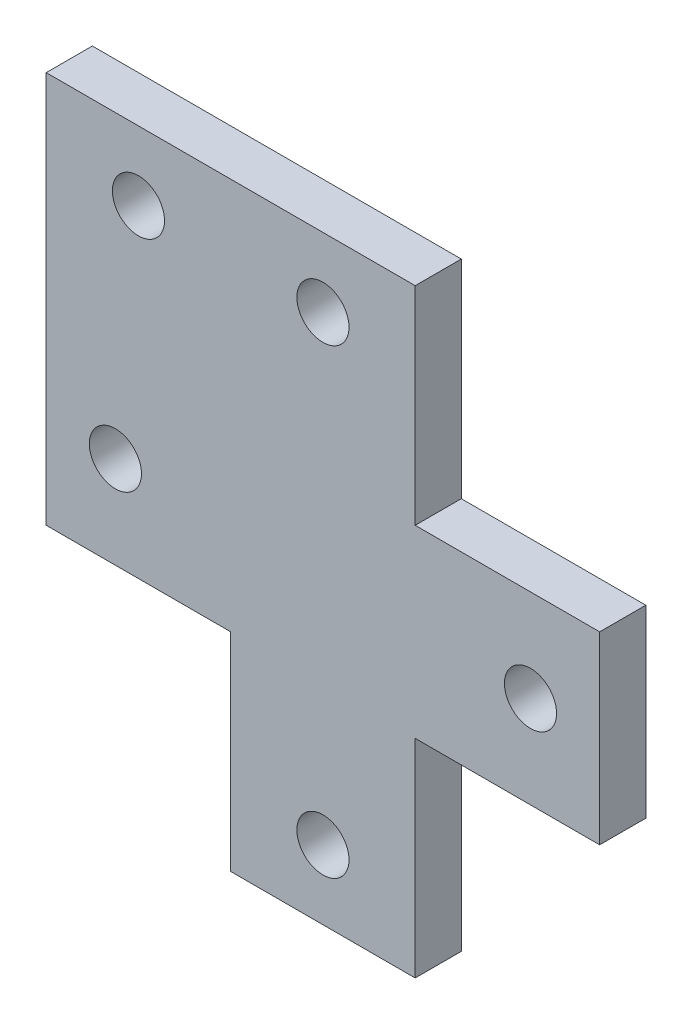
ISO-10303-21;
HEADER;
FILE_DESCRIPTION(('STEP AP214'),'2;1');
FILE_NAME('part.step','',(''),(''),'','','');
FILE_SCHEMA(('AUTOMOTIVE_DESIGN { 1 0 10303 214 1 1 1 1 }'));
ENDSEC;
DATA;
#1=APPLICATION_CONTEXT('core data for automotive mechanical design processes');
#2=APPLICATION_PROTOCOL_DEFINITION('international standard','automotive_design',2000,#1);
#3=PRODUCT_CONTEXT('',#1,'mechanical');
#4=PRODUCT('Part','Part','',(#3));
#5=PRODUCT_RELATED_PRODUCT_CATEGORY('part','',(#4));
#6=PRODUCT_DEFINITION_FORMATION('','',#4);
#7=PRODUCT_DEFINITION_CONTEXT('part definition',#1,'design');
#8=PRODUCT_DEFINITION('design','',#6,#7);
#9=PRODUCT_DEFINITION_SHAPE('','',#8);
#10=(LENGTH_UNIT() NAMED_UNIT(*) SI_UNIT(.MILLI.,.METRE.));
#11=(NAMED_UNIT(*) PLANE_ANGLE_UNIT() SI_UNIT($,.RADIAN.));
#12=(NAMED_UNIT(*) SI_UNIT($,.STERADIAN.) SOLID_ANGLE_UNIT());
#13=UNCERTAINTY_MEASURE_WITH_UNIT(LENGTH_MEASURE(1.E-05),#10,'distance_accuracy_value','');
#14=(GEOMETRIC_REPRESENTATION_CONTEXT(3) GLOBAL_UNCERTAINTY_ASSIGNED_CONTEXT((#13)) GLOBAL_UNIT_ASSIGNED_CONTEXT((#10,
#11,#12)) REPRESENTATION_CONTEXT('',''));
#15=CARTESIAN_POINT('',(0.,0.,0.));
#16=DIRECTION('',(0.,0.,1.));
#17=DIRECTION('',(1.,0.,0.));
#18=AXIS2_PLACEMENT_3D('',#15,#16,#17);
#19=CARTESIAN_POINT('',(0.,0.,2.));
#20=DIRECTION('',(0.,1.,0.));
#21=DIRECTION('',(0.,0.,1.));
#22=AXIS2_PLACEMENT_3D('',#19,#20,#21);
#23=PLANE('',#22);
#24=DIRECTION('',(1.,0.,0.));
#25=VECTOR('',#24,1.);
#26=CARTESIAN_POINT('',(0.,0.,0.));
#27=LINE('',#26,#25);
#28=CARTESIAN_POINT('',(-8.,0.,0.));
#29=VERTEX_POINT('',#28);
#30=CARTESIAN_POINT('',(8.,0.,0.));
#31=VERTEX_POINT('',#30);
#32=EDGE_CURVE('E162',#29,#31,#27,.T.);
#33=ORIENTED_EDGE('',*,*,#32,.F.);
#34=DIRECTION('',(0.,0.,-1.));
#35=VECTOR('',#34,1.);
#36=CARTESIAN_POINT('',(-8.,0.,2.));
#37=LINE('',#36,#35);
#38=CARTESIAN_POINT('',(-8.,0.,2.));
#39=VERTEX_POINT('',#38);
#40=EDGE_CURVE('E11',#39,#29,#37,.T.);
#41=ORIENTED_EDGE('',*,*,#40,.F.);
#42=DIRECTION('',(1.,0.,0.));
#43=VECTOR('',#42,1.);
#44=CARTESIAN_POINT('',(0.,0.,2.));
#45=LINE('',#44,#43);
#46=CARTESIAN_POINT('',(8.,0.,2.));
#47=VERTEX_POINT('',#46);
#48=EDGE_CURVE('E199',#39,#47,#45,.T.);
#49=ORIENTED_EDGE('',*,*,#48,.T.);
#50=DIRECTION('',(0.,0.,-1.));
#51=VECTOR('',#50,1.);
#52=CARTESIAN_POINT('',(8.,0.,2.));
#53=LINE('',#52,#51);
#54=EDGE_CURVE('E68',#47,#31,#53,.T.);
#55=ORIENTED_EDGE('',*,*,#54,.T.);
#56=EDGE_LOOP('',(#33,#41,#49,#55));
#57=FACE_BOUND('',#56,.T.);
#58=ADVANCED_FACE('F51',(#57),#23,.T.);
#59=CARTESIAN_POINT('',(-8.,0.,2.));
#60=DIRECTION('',(1.,0.,0.));
#61=DIRECTION('',(0.,0.,-1.));
#62=AXIS2_PLACEMENT_3D('',#59,#60,#61);
#63=PLANE('',#62);
#64=DIRECTION('',(0.,-1.,0.));
#65=VECTOR('',#64,1.);
#66=CARTESIAN_POINT('',(-8.,0.,0.));
#67=LINE('',#66,#65);
#68=CARTESIAN_POINT('',(-8.,-17.,0.));
#69=VERTEX_POINT('',#68);
#70=EDGE_CURVE('E165',#29,#69,#67,.T.);
#71=ORIENTED_EDGE('',*,*,#70,.T.);
#72=DIRECTION('',(0.,0.,-1.));
#73=VECTOR('',#72,1.);
#74=CARTESIAN_POINT('',(-8.,-17.,2.));
#75=LINE('',#74,#73);
#76=CARTESIAN_POINT('',(-8.,-17.,2.));
#77=VERTEX_POINT('',#76);
#78=EDGE_CURVE('E60',#77,#69,#75,.T.);
#79=ORIENTED_EDGE('',*,*,#78,.F.);
#80=DIRECTION('',(0.,-1.,0.));
#81=VECTOR('',#80,1.);
#82=CARTESIAN_POINT('',(-8.,0.,2.));
#83=LINE('',#82,#81);
#84=EDGE_CURVE('E337',#39,#77,#83,.T.);
#85=ORIENTED_EDGE('',*,*,#84,.F.);
#86=ORIENTED_EDGE('',*,*,#40,.T.);
#87=EDGE_LOOP('',(#71,#79,#85,#86));
#88=FACE_BOUND('',#87,.T.);
#89=ADVANCED_FACE('F230',(#88),#63,.F.);
#90=CARTESIAN_POINT('',(0.,-17.,2.));
#91=DIRECTION('',(0.,1.,0.));
#92=DIRECTION('',(0.,0.,1.));
#93=AXIS2_PLACEMENT_3D('',#90,#91,#92);
#94=PLANE('',#93);
#95=DIRECTION('',(1.,0.,0.));
#96=VECTOR('',#95,1.);
#97=CARTESIAN_POINT('',(0.,-17.,0.));
#98=LINE('',#97,#96);
#99=CARTESIAN_POINT('',(0.,-17.,0.));
#100=VERTEX_POINT('',#99);
#101=EDGE_CURVE('E170',#69,#100,#98,.T.);
#102=ORIENTED_EDGE('',*,*,#101,.T.);
#103=DIRECTION('',(0.,0.,-1.));
#104=VECTOR('',#103,1.);
#105=CARTESIAN_POINT('',(0.,-17.,2.));
#106=LINE('',#105,#104);
#107=CARTESIAN_POINT('',(0.,-17.,2.));
#108=VERTEX_POINT('',#107);
#109=EDGE_CURVE('E216',#108,#100,#106,.T.);
#110=ORIENTED_EDGE('',*,*,#109,.F.);
#111=DIRECTION('',(1.,0.,0.));
#112=VECTOR('',#111,1.);
#113=CARTESIAN_POINT('',(0.,-17.,2.));
#114=LINE('',#113,#112);
#115=EDGE_CURVE('E226',#77,#108,#114,.T.);
#116=ORIENTED_EDGE('',*,*,#115,.F.);
#117=ORIENTED_EDGE('',*,*,#78,.T.);
#118=EDGE_LOOP('',(#102,#110,#116,#117));
#119=FACE_BOUND('',#118,.T.);
#120=ADVANCED_FACE('F223',(#119),#94,.F.);
#121=CARTESIAN_POINT('',(0.,0.,2.));
#122=DIRECTION('',(1.,0.,0.));
#123=DIRECTION('',(0.,0.,-1.));
#124=AXIS2_PLACEMENT_3D('',#121,#122,#123);
#125=PLANE('',#124);
#126=DIRECTION('',(0.,-1.,0.));
#127=VECTOR('',#126,1.);
#128=CARTESIAN_POINT('',(0.,0.,0.));
#129=LINE('',#128,#127);
#130=CARTESIAN_POINT('',(0.,-26.,0.));
#131=VERTEX_POINT('',#130);
#132=EDGE_CURVE('E174',#100,#131,#129,.T.);
#133=ORIENTED_EDGE('',*,*,#132,.T.);
#134=DIRECTION('',(0.,0.,-1.));
#135=VECTOR('',#134,1.);
#136=CARTESIAN_POINT('',(0.,-26.,2.));
#137=LINE('',#136,#135);
#138=CARTESIAN_POINT('',(0.,-26.,2.));
#139=VERTEX_POINT('',#138);
#140=EDGE_CURVE('E212',#139,#131,#137,.T.);
#141=ORIENTED_EDGE('',*,*,#140,.F.);
#142=DIRECTION('',(0.,-1.,0.));
#143=VECTOR('',#142,1.);
#144=CARTESIAN_POINT('',(0.,0.,2.));
#145=LINE('',#144,#143);
#146=EDGE_CURVE('E342',#108,#139,#145,.T.);
#147=ORIENTED_EDGE('',*,*,#146,.F.);
#148=ORIENTED_EDGE('',*,*,#109,.T.);
#149=EDGE_LOOP('',(#133,#141,#147,#148));
#150=FACE_BOUND('',#149,.T.);
#151=ADVANCED_FACE('F240',(#150),#125,.F.);
#152=CARTESIAN_POINT('',(0.,-26.,2.));
#153=DIRECTION('',(0.,1.,0.));
#154=DIRECTION('',(0.,0.,1.));
#155=AXIS2_PLACEMENT_3D('',#152,#153,#154);
#156=PLANE('',#155);
#157=DIRECTION('',(1.,0.,0.));
#158=VECTOR('',#157,1.);
#159=CARTESIAN_POINT('',(0.,-26.,0.));
#160=LINE('',#159,#158);
#161=CARTESIAN_POINT('',(8.,-26.,0.));
#162=VERTEX_POINT('',#161);
#163=EDGE_CURVE('E178',#131,#162,#160,.T.);
#164=ORIENTED_EDGE('',*,*,#163,.T.);
#165=DIRECTION('',(0.,0.,-1.));
#166=VECTOR('',#165,1.);
#167=CARTESIAN_POINT('',(8.,-26.,2.));
#168=LINE('',#167,#166);
#169=CARTESIAN_POINT('',(8.,-26.,2.));
#170=VERTEX_POINT('',#169);
#171=EDGE_CURVE('E209',#170,#162,#168,.T.);
#172=ORIENTED_EDGE('',*,*,#171,.F.);
#173=DIRECTION('',(1.,0.,0.));
#174=VECTOR('',#173,1.);
#175=CARTESIAN_POINT('',(0.,-26.,2.));
#176=LINE('',#175,#174);
#177=EDGE_CURVE('E346',#139,#170,#176,.T.);
#178=ORIENTED_EDGE('',*,*,#177,.F.);
#179=ORIENTED_EDGE('',*,*,#140,.T.);
#180=EDGE_LOOP('',(#164,#172,#178,#179));
#181=FACE_BOUND('',#180,.T.);
#182=ADVANCED_FACE('F245',(#181),#156,.F.);
#183=CARTESIAN_POINT('',(8.,0.,2.));
#184=DIRECTION('',(1.,0.,0.));
#185=DIRECTION('',(0.,1.,0.));
#186=AXIS2_PLACEMENT_3D('',#183,#184,#185);
#187=PLANE('',#186);
#188=DIRECTION('',(0.,-1.,0.));
#189=VECTOR('',#188,1.);
#190=CARTESIAN_POINT('',(8.,0.,0.));
#191=LINE('',#190,#189);
#192=CARTESIAN_POINT('',(8.,-17.,0.));
#193=VERTEX_POINT('',#192);
#194=EDGE_CURVE('E182',#193,#162,#191,.T.);
#195=ORIENTED_EDGE('',*,*,#194,.F.);
#196=DIRECTION('',(0.,0.,-1.));
#197=VECTOR('',#196,1.);
#198=CARTESIAN_POINT('',(8.,-17.,2.));
#199=LINE('',#198,#197);
#200=CARTESIAN_POINT('',(8.,-17.,2.));
#201=VERTEX_POINT('',#200);
#202=EDGE_CURVE('E206',#201,#193,#199,.T.);
#203=ORIENTED_EDGE('',*,*,#202,.F.);
#204=DIRECTION('',(0.,-1.,0.));
#205=VECTOR('',#204,1.);
#206=CARTESIAN_POINT('',(8.,0.,2.));
#207=LINE('',#206,#205);
#208=EDGE_CURVE('E349',#201,#170,#207,.T.);
#209=ORIENTED_EDGE('',*,*,#208,.T.);
#210=ORIENTED_EDGE('',*,*,#171,.T.);
#211=EDGE_LOOP('',(#195,#203,#209,#210));
#212=FACE_BOUND('',#211,.T.);
#213=ADVANCED_FACE('F249',(#212),#187,.T.);
#214=CARTESIAN_POINT('',(0.,-17.,2.));
#215=DIRECTION('',(0.,1.,0.));
#216=DIRECTION('',(0.,0.,1.));
#217=AXIS2_PLACEMENT_3D('',#214,#215,#216);
#218=PLANE('',#217);
#219=DIRECTION('',(1.,0.,0.));
#220=VECTOR('',#219,1.);
#221=CARTESIAN_POINT('',(0.,-17.,0.));
#222=LINE('',#221,#220);
#223=CARTESIAN_POINT('',(16.,-17.,0.));
#224=VERTEX_POINT('',#223);
#225=EDGE_CURVE('E186',#193,#224,#222,.T.);
#226=ORIENTED_EDGE('',*,*,#225,.T.);
#227=DIRECTION('',(0.,0.,-1.));
#228=VECTOR('',#227,1.);
#229=CARTESIAN_POINT('',(16.,-17.,2.));
#230=LINE('',#229,#228);
#231=CARTESIAN_POINT('',(16.,-17.,2.));
#232=VERTEX_POINT('',#231);
#233=EDGE_CURVE('E140',#232,#224,#230,.T.);
#234=ORIENTED_EDGE('',*,*,#233,.F.);
#235=DIRECTION('',(1.,0.,0.));
#236=VECTOR('',#235,1.);
#237=CARTESIAN_POINT('',(0.,-17.,2.));
#238=LINE('',#237,#236);
#239=EDGE_CURVE('E150',#201,#232,#238,.T.);
#240=ORIENTED_EDGE('',*,*,#239,.F.);
#241=ORIENTED_EDGE('',*,*,#202,.T.);
#242=EDGE_LOOP('',(#226,#234,#240,#241));
#243=FACE_BOUND('',#242,.T.);
#244=ADVANCED_FACE('F253',(#243),#218,.F.);
#245=CARTESIAN_POINT('',(16.,0.,2.));
#246=DIRECTION('',(1.,0.,0.));
#247=DIRECTION('',(0.,0.,-1.));
#248=AXIS2_PLACEMENT_3D('',#245,#246,#247);
#249=PLANE('',#248);
#250=DIRECTION('',(0.,-1.,0.));
#251=VECTOR('',#250,1.);
#252=CARTESIAN_POINT('',(16.,0.,0.));
#253=LINE('',#252,#251);
#254=CARTESIAN_POINT('',(16.,-9.,0.));
#255=VERTEX_POINT('',#254);
#256=EDGE_CURVE('E135',#255,#224,#253,.T.);
#257=ORIENTED_EDGE('',*,*,#256,.F.);
#258=DIRECTION('',(0.,0.,-1.));
#259=VECTOR('',#258,1.);
#260=CARTESIAN_POINT('',(16.,-9.,2.));
#261=LINE('',#260,#259);
#262=CARTESIAN_POINT('',(16.,-9.,2.));
#263=VERTEX_POINT('',#262);
#264=EDGE_CURVE('E130',#263,#255,#261,.T.);
#265=ORIENTED_EDGE('',*,*,#264,.F.);
#266=DIRECTION('',(0.,-1.,0.));
#267=VECTOR('',#266,1.);
#268=CARTESIAN_POINT('',(16.,0.,2.));
#269=LINE('',#268,#267);
#270=EDGE_CURVE('E133',#263,#232,#269,.T.);
#271=ORIENTED_EDGE('',*,*,#270,.T.);
#272=ORIENTED_EDGE('',*,*,#233,.T.);
#273=EDGE_LOOP('',(#257,#265,#271,#272));
#274=FACE_BOUND('',#273,.T.);
#275=ADVANCED_FACE('F132',(#274),#249,.T.);
#276=CARTESIAN_POINT('',(0.,-9.,2.));
#277=DIRECTION('',(0.,1.,0.));
#278=DIRECTION('',(0.,0.,1.));
#279=AXIS2_PLACEMENT_3D('',#276,#277,#278);
#280=PLANE('',#279);
#281=DIRECTION('',(1.,0.,0.));
#282=VECTOR('',#281,1.);
#283=CARTESIAN_POINT('',(0.,-9.,0.));
#284=LINE('',#283,#282);
#285=CARTESIAN_POINT('',(8.,-9.,0.));
#286=VERTEX_POINT('',#285);
#287=EDGE_CURVE('E192',#286,#255,#284,.T.);
#288=ORIENTED_EDGE('',*,*,#287,.F.);
#289=DIRECTION('',(0.,0.,-1.));
#290=VECTOR('',#289,1.);
#291=CARTESIAN_POINT('',(8.,-9.,2.));
#292=LINE('',#291,#290);
#293=CARTESIAN_POINT('',(8.,-9.,2.));
#294=VERTEX_POINT('',#293);
#295=EDGE_CURVE('E99',#294,#286,#292,.T.);
#296=ORIENTED_EDGE('',*,*,#295,.F.);
#297=DIRECTION('',(1.,0.,0.));
#298=VECTOR('',#297,1.);
#299=CARTESIAN_POINT('',(0.,-9.,2.));
#300=LINE('',#299,#298);
#301=EDGE_CURVE('E147',#294,#263,#300,.T.);
#302=ORIENTED_EDGE('',*,*,#301,.T.);
#303=ORIENTED_EDGE('',*,*,#264,.T.);
#304=EDGE_LOOP('',(#288,#296,#302,#303));
#305=FACE_BOUND('',#304,.T.);
#306=ADVANCED_FACE('F154',(#305),#280,.T.);
#307=CARTESIAN_POINT('',(8.,0.,2.));
#308=DIRECTION('',(1.,0.,0.));
#309=DIRECTION('',(0.,1.,0.));
#310=AXIS2_PLACEMENT_3D('',#307,#308,#309);
#311=PLANE('',#310);
#312=DIRECTION('',(0.,-1.,0.));
#313=VECTOR('',#312,1.);
#314=CARTESIAN_POINT('',(8.,0.,0.));
#315=LINE('',#314,#313);
#316=EDGE_CURVE('E195',#31,#286,#315,.T.);
#317=ORIENTED_EDGE('',*,*,#316,.F.);
#318=ORIENTED_EDGE('',*,*,#54,.F.);
#319=DIRECTION('',(0.,-1.,0.));
#320=VECTOR('',#319,1.);
#321=CARTESIAN_POINT('',(8.,0.,2.));
#322=LINE('',#321,#320);
#323=EDGE_CURVE('E156',#47,#294,#322,.T.);
#324=ORIENTED_EDGE('',*,*,#323,.T.);
#325=ORIENTED_EDGE('',*,*,#295,.T.);
#326=EDGE_LOOP('',(#317,#318,#324,#325));
#327=FACE_BOUND('',#326,.T.);
#328=ADVANCED_FACE('F262',(#327),#311,.T.);
#329=CARTESIAN_POINT('',(0.,0.,2.));
#330=DIRECTION('',(0.,0.,1.));
#331=DIRECTION('',(1.,0.,0.));
#332=AXIS2_PLACEMENT_3D('',#329,#330,#331);
#333=PLANE('',#332);
#334=CARTESIAN_POINT('',(-5.,-13.,2.));
#335=DIRECTION('',(0.,0.,1.));
#336=DIRECTION('',(1.,0.,0.));
#337=AXIS2_PLACEMENT_3D('',#334,#335,#336);
#338=CIRCLE('',#337,1.1303);
#339=CARTESIAN_POINT('',(-3.8697,-13.,2.));
#340=VERTEX_POINT('',#339);
#341=EDGE_CURVE('E298',#340,#340,#338,.T.);
#342=ORIENTED_EDGE('',*,*,#341,.F.);
#343=EDGE_LOOP('',(#342));
#344=FACE_BOUND('',#343,.T.);
#345=CARTESIAN_POINT('',(13.,-13.,2.));
#346=DIRECTION('',(0.,0.,1.));
#347=DIRECTION('',(1.,0.,0.));
#348=AXIS2_PLACEMENT_3D('',#345,#346,#347);
#349=CIRCLE('',#348,1.1303);
#350=CARTESIAN_POINT('',(14.1303,-13.,2.));
#351=VERTEX_POINT('',#350);
#352=EDGE_CURVE('E302',#351,#351,#349,.T.);
#353=ORIENTED_EDGE('',*,*,#352,.F.);
#354=EDGE_LOOP('',(#353));
#355=FACE_BOUND('',#354,.T.);
#356=CARTESIAN_POINT('',(4.,-23.,2.));
#357=DIRECTION('',(0.,0.,1.));
#358=DIRECTION('',(1.,0.,0.));
#359=AXIS2_PLACEMENT_3D('',#356,#357,#358);
#360=CIRCLE('',#359,1.1303);
#361=CARTESIAN_POINT('',(5.1303,-23.,2.));
#362=VERTEX_POINT('',#361);
#363=EDGE_CURVE('E312',#362,#362,#360,.T.);
#364=ORIENTED_EDGE('',*,*,#363,.F.);
#365=EDGE_LOOP('',(#364));
#366=FACE_BOUND('',#365,.T.);
#367=CARTESIAN_POINT('',(4.,-3.,2.));
#368=DIRECTION('',(0.,0.,1.));
#369=DIRECTION('',(1.,0.,0.));
#370=AXIS2_PLACEMENT_3D('',#367,#368,#369);
#371=CIRCLE('',#370,1.1303);
#372=CARTESIAN_POINT('',(5.1303,-3.,2.));
#373=VERTEX_POINT('',#372);
#374=EDGE_CURVE('E320',#373,#373,#371,.T.);
#375=ORIENTED_EDGE('',*,*,#374,.F.);
#376=EDGE_LOOP('',(#375));
#377=FACE_BOUND('',#376,.T.);
#378=CARTESIAN_POINT('',(-4.,-3.,2.));
#379=DIRECTION('',(0.,0.,1.));
#380=DIRECTION('',(1.,0.,0.));
#381=AXIS2_PLACEMENT_3D('',#378,#379,#380);
#382=CIRCLE('',#381,1.1303);
#383=CARTESIAN_POINT('',(-2.8697,-3.,2.));
#384=VERTEX_POINT('',#383);
#385=EDGE_CURVE('E328',#384,#384,#382,.T.);
#386=ORIENTED_EDGE('',*,*,#385,.F.);
#387=EDGE_LOOP('',(#386));
#388=FACE_BOUND('',#387,.T.);
#389=ORIENTED_EDGE('',*,*,#48,.F.);
#390=ORIENTED_EDGE('',*,*,#84,.T.);
#391=ORIENTED_EDGE('',*,*,#115,.T.);
#392=ORIENTED_EDGE('',*,*,#146,.T.);
#393=ORIENTED_EDGE('',*,*,#177,.T.);
#394=ORIENTED_EDGE('',*,*,#208,.F.);
#395=ORIENTED_EDGE('',*,*,#239,.T.);
#396=ORIENTED_EDGE('',*,*,#270,.F.);
#397=ORIENTED_EDGE('',*,*,#301,.F.);
#398=ORIENTED_EDGE('',*,*,#323,.F.);
#399=EDGE_LOOP('',(#389,#390,#391,#392,#393,#394,#395,#396,#397,#398));
#400=FACE_BOUND('',#399,.T.);
#401=ADVANCED_FACE('F145',(#344,#355,#366,#377,#388,#400),#333,.T.);
#402=CARTESIAN_POINT('',(0.,0.,0.));
#403=DIRECTION('',(0.,0.,1.));
#404=DIRECTION('',(1.,0.,0.));
#405=AXIS2_PLACEMENT_3D('',#402,#403,#404);
#406=PLANE('',#405);
#407=CARTESIAN_POINT('',(-5.,-13.,0.));
#408=DIRECTION('',(0.,0.,1.));
#409=DIRECTION('',(1.,0.,0.));
#410=AXIS2_PLACEMENT_3D('',#407,#408,#409);
#411=CIRCLE('',#410,1.1303);
#412=CARTESIAN_POINT('',(-3.8697,-13.,0.));
#413=VERTEX_POINT('',#412);
#414=EDGE_CURVE('E295',#413,#413,#411,.T.);
#415=ORIENTED_EDGE('',*,*,#414,.T.);
#416=EDGE_LOOP('',(#415));
#417=FACE_BOUND('',#416,.T.);
#418=CARTESIAN_POINT('',(13.,-13.,0.));
#419=DIRECTION('',(0.,0.,1.));
#420=DIRECTION('',(1.,0.,0.));
#421=AXIS2_PLACEMENT_3D('',#418,#419,#420);
#422=CIRCLE('',#421,1.1303);
#423=CARTESIAN_POINT('',(14.1303,-13.,0.));
#424=VERTEX_POINT('',#423);
#425=EDGE_CURVE('E308',#424,#424,#422,.T.);
#426=ORIENTED_EDGE('',*,*,#425,.T.);
#427=EDGE_LOOP('',(#426));
#428=FACE_BOUND('',#427,.T.);
#429=CARTESIAN_POINT('',(4.,-23.,0.));
#430=DIRECTION('',(0.,0.,1.));
#431=DIRECTION('',(1.,0.,0.));
#432=AXIS2_PLACEMENT_3D('',#429,#430,#431);
#433=CIRCLE('',#432,1.1303);
#434=CARTESIAN_POINT('',(5.1303,-23.,0.));
#435=VERTEX_POINT('',#434);
#436=EDGE_CURVE('E316',#435,#435,#433,.T.);
#437=ORIENTED_EDGE('',*,*,#436,.T.);
#438=EDGE_LOOP('',(#437));
#439=FACE_BOUND('',#438,.T.);
#440=CARTESIAN_POINT('',(4.,-3.,0.));
#441=DIRECTION('',(0.,0.,1.));
#442=DIRECTION('',(1.,0.,0.));
#443=AXIS2_PLACEMENT_3D('',#440,#441,#442);
#444=CIRCLE('',#443,1.1303);
#445=CARTESIAN_POINT('',(5.1303,-3.,0.));
#446=VERTEX_POINT('',#445);
#447=EDGE_CURVE('E324',#446,#446,#444,.T.);
#448=ORIENTED_EDGE('',*,*,#447,.T.);
#449=EDGE_LOOP('',(#448));
#450=FACE_BOUND('',#449,.T.);
#451=CARTESIAN_POINT('',(-4.,-3.,0.));
#452=DIRECTION('',(0.,0.,1.));
#453=DIRECTION('',(1.,0.,0.));
#454=AXIS2_PLACEMENT_3D('',#451,#452,#453);
#455=CIRCLE('',#454,1.1303);
#456=CARTESIAN_POINT('',(-2.8697,-3.,0.));
#457=VERTEX_POINT('',#456);
#458=EDGE_CURVE('E166',#457,#457,#455,.T.);
#459=ORIENTED_EDGE('',*,*,#458,.T.);
#460=EDGE_LOOP('',(#459));
#461=FACE_BOUND('',#460,.T.);
#462=ORIENTED_EDGE('',*,*,#32,.T.);
#463=ORIENTED_EDGE('',*,*,#316,.T.);
#464=ORIENTED_EDGE('',*,*,#287,.T.);
#465=ORIENTED_EDGE('',*,*,#256,.T.);
#466=ORIENTED_EDGE('',*,*,#225,.F.);
#467=ORIENTED_EDGE('',*,*,#194,.T.);
#468=ORIENTED_EDGE('',*,*,#163,.F.);
#469=ORIENTED_EDGE('',*,*,#132,.F.);
#470=ORIENTED_EDGE('',*,*,#101,.F.);
#471=ORIENTED_EDGE('',*,*,#70,.F.);
#472=EDGE_LOOP('',(#462,#463,#464,#465,#466,#467,#468,#469,#470,#471));
#473=FACE_BOUND('',#472,.T.);
#474=ADVANCED_FACE('F232',(#417,#428,#439,#450,#461,#473),#406,.F.);
#475=CARTESIAN_POINT('',(-4.,-3.,2.));
#476=DIRECTION('',(0.,0.,1.));
#477=DIRECTION('',(1.,0.,0.));
#478=AXIS2_PLACEMENT_3D('',#475,#476,#477);
#479=CYLINDRICAL_SURFACE('',#478,1.1303);
#480=ORIENTED_EDGE('',*,*,#458,.F.);
#481=EDGE_LOOP('',(#480));
#482=FACE_BOUND('',#481,.T.);
#483=ORIENTED_EDGE('',*,*,#385,.T.);
#484=EDGE_LOOP('',(#483));
#485=FACE_BOUND('',#484,.T.);
#486=ADVANCED_FACE('F267',(#482,#485),#479,.F.);
#487=CARTESIAN_POINT('',(4.,-3.,2.));
#488=DIRECTION('',(0.,0.,1.));
#489=DIRECTION('',(1.,0.,0.));
#490=AXIS2_PLACEMENT_3D('',#487,#488,#489);
#491=CYLINDRICAL_SURFACE('',#490,1.1303);
#492=ORIENTED_EDGE('',*,*,#447,.F.);
#493=EDGE_LOOP('',(#492));
#494=FACE_BOUND('',#493,.T.);
#495=ORIENTED_EDGE('',*,*,#374,.T.);
#496=EDGE_LOOP('',(#495));
#497=FACE_BOUND('',#496,.T.);
#498=ADVANCED_FACE('F274',(#494,#497),#491,.F.);
#499=CARTESIAN_POINT('',(4.,-23.,2.));
#500=DIRECTION('',(0.,0.,1.));
#501=DIRECTION('',(1.,0.,0.));
#502=AXIS2_PLACEMENT_3D('',#499,#500,#501);
#503=CYLINDRICAL_SURFACE('',#502,1.1303);
#504=ORIENTED_EDGE('',*,*,#436,.F.);
#505=EDGE_LOOP('',(#504));
#506=FACE_BOUND('',#505,.T.);
#507=ORIENTED_EDGE('',*,*,#363,.T.);
#508=EDGE_LOOP('',(#507));
#509=FACE_BOUND('',#508,.T.);
#510=ADVANCED_FACE('F278',(#506,#509),#503,.F.);
#511=CARTESIAN_POINT('',(13.,-13.,2.));
#512=DIRECTION('',(0.,0.,1.));
#513=DIRECTION('',(1.,0.,0.));
#514=AXIS2_PLACEMENT_3D('',#511,#512,#513);
#515=CYLINDRICAL_SURFACE('',#514,1.1303);
#516=ORIENTED_EDGE('',*,*,#425,.F.);
#517=EDGE_LOOP('',(#516));
#518=FACE_BOUND('',#517,.T.);
#519=ORIENTED_EDGE('',*,*,#352,.T.);
#520=EDGE_LOOP('',(#519));
#521=FACE_BOUND('',#520,.T.);
#522=ADVANCED_FACE('F282',(#518,#521),#515,.F.);
#523=CARTESIAN_POINT('',(-5.,-13.,2.));
#524=DIRECTION('',(0.,0.,1.));
#525=DIRECTION('',(1.,0.,0.));
#526=AXIS2_PLACEMENT_3D('',#523,#524,#525);
#527=CYLINDRICAL_SURFACE('',#526,1.1303);
#528=ORIENTED_EDGE('',*,*,#414,.F.);
#529=EDGE_LOOP('',(#528));
#530=FACE_BOUND('',#529,.T.);
#531=ORIENTED_EDGE('',*,*,#341,.T.);
#532=EDGE_LOOP('',(#531));
#533=FACE_BOUND('',#532,.T.);
#534=ADVANCED_FACE('F286',(#530,#533),#527,.F.);
#535=CLOSED_SHELL('',(#58,#89,#120,#151,#182,#213,#244,#275,#306,#328,#401,#474,#486,#498,#510,
#522,#534));
#536=MANIFOLD_SOLID_BREP('B2',#535);
#537=ADVANCED_BREP_SHAPE_REPRESENTATION('',(#18,#536),#14);
#538=SHAPE_DEFINITION_REPRESENTATION(#9,#537);
ENDSEC;
END-ISO-10303-21;
